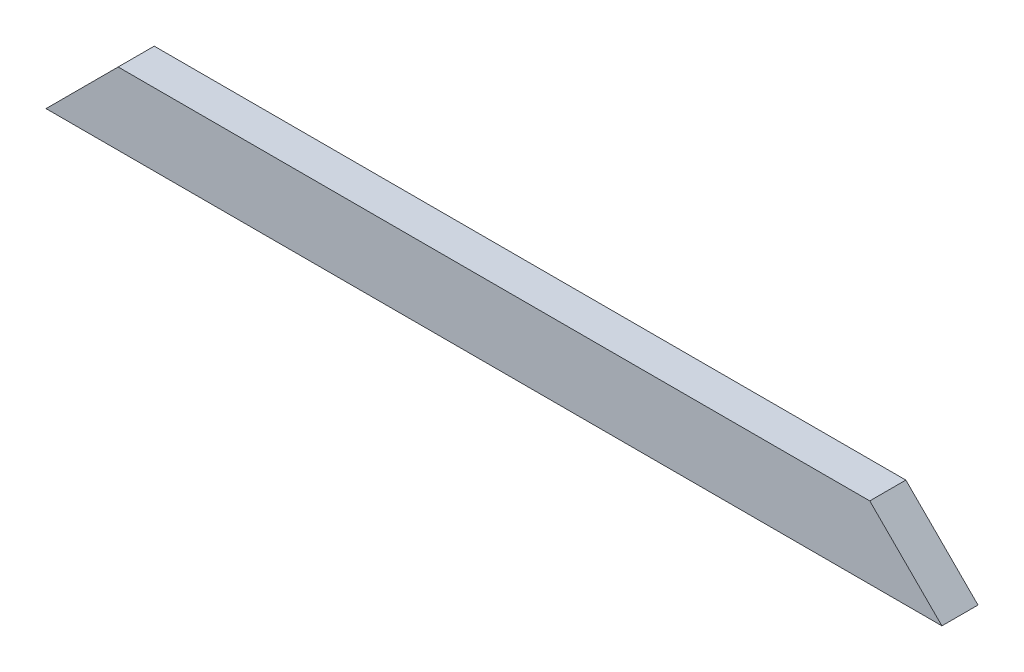
ISO-10303-21;
HEADER;
FILE_DESCRIPTION(('STEP AP214'),'2;1');
FILE_NAME('part.step','',(''),(''),'','','');
FILE_SCHEMA(('AUTOMOTIVE_DESIGN { 1 0 10303 214 1 1 1 1 }'));
ENDSEC;
DATA;
#1=APPLICATION_CONTEXT('core data for automotive mechanical design processes');
#2=APPLICATION_PROTOCOL_DEFINITION('international standard','automotive_design',2000,#1);
#3=PRODUCT_CONTEXT('',#1,'mechanical');
#4=PRODUCT('Part','Part','',(#3));
#5=PRODUCT_RELATED_PRODUCT_CATEGORY('part','',(#4));
#6=PRODUCT_DEFINITION_FORMATION('','',#4);
#7=PRODUCT_DEFINITION_CONTEXT('part definition',#1,'design');
#8=PRODUCT_DEFINITION('design','',#6,#7);
#9=PRODUCT_DEFINITION_SHAPE('','',#8);
#10=(LENGTH_UNIT() NAMED_UNIT(*) SI_UNIT(.MILLI.,.METRE.));
#11=(NAMED_UNIT(*) PLANE_ANGLE_UNIT() SI_UNIT($,.RADIAN.));
#12=(NAMED_UNIT(*) SI_UNIT($,.STERADIAN.) SOLID_ANGLE_UNIT());
#13=UNCERTAINTY_MEASURE_WITH_UNIT(LENGTH_MEASURE(1.E-05),#10,'distance_accuracy_value','');
#14=(GEOMETRIC_REPRESENTATION_CONTEXT(3) GLOBAL_UNCERTAINTY_ASSIGNED_CONTEXT((#13)) GLOBAL_UNIT_ASSIGNED_CONTEXT((#10,
#11,#12)) REPRESENTATION_CONTEXT('',''));
#15=CARTESIAN_POINT('',(0.,0.,0.));
#16=DIRECTION('',(0.,0.,1.));
#17=DIRECTION('',(1.,0.,0.));
#18=AXIS2_PLACEMENT_3D('',#15,#16,#17);
#19=CARTESIAN_POINT('',(0.,0.,19.05));
#20=DIRECTION('',(0.,1.,0.));
#21=DIRECTION('',(0.,0.,1.));
#22=AXIS2_PLACEMENT_3D('',#19,#20,#21);
#23=PLANE('',#22);
#24=DIRECTION('',(1.,0.,0.));
#25=VECTOR('',#24,1.);
#26=CARTESIAN_POINT('',(0.,0.,0.));
#27=LINE('',#26,#25);
#28=CARTESIAN_POINT('',(0.,0.,0.));
#29=VERTEX_POINT('',#28);
#30=CARTESIAN_POINT('',(473.075,0.,0.));
#31=VERTEX_POINT('',#30);
#32=EDGE_CURVE('E96',#29,#31,#27,.T.);
#33=ORIENTED_EDGE('',*,*,#32,.T.);
#34=DIRECTION('',(0.,0.,-1.));
#35=VECTOR('',#34,1.);
#36=CARTESIAN_POINT('',(473.075,0.,19.05));
#37=LINE('',#36,#35);
#38=CARTESIAN_POINT('',(473.075,0.,19.05));
#39=VERTEX_POINT('',#38);
#40=EDGE_CURVE('E11',#39,#31,#37,.T.);
#41=ORIENTED_EDGE('',*,*,#40,.F.);
#42=DIRECTION('',(1.,0.,0.));
#43=VECTOR('',#42,1.);
#44=CARTESIAN_POINT('',(0.,0.,19.05));
#45=LINE('',#44,#43);
#46=CARTESIAN_POINT('',(0.,0.,19.05));
#47=VERTEX_POINT('',#46);
#48=EDGE_CURVE('E84',#47,#39,#45,.T.);
#49=ORIENTED_EDGE('',*,*,#48,.F.);
#50=DIRECTION('',(0.,0.,-1.));
#51=VECTOR('',#50,1.);
#52=CARTESIAN_POINT('',(0.,0.,19.05));
#53=LINE('',#52,#51);
#54=EDGE_CURVE('E92',#47,#29,#53,.T.);
#55=ORIENTED_EDGE('',*,*,#54,.T.);
#56=EDGE_LOOP('',(#33,#41,#49,#55));
#57=FACE_BOUND('',#56,.T.);
#58=ADVANCED_FACE('F33',(#57),#23,.F.);
#59=CARTESIAN_POINT('',(473.075,0.,19.05));
#60=DIRECTION('',(-0.707106781186545,-0.70710678118655,0.));
#61=DIRECTION('',(0.70710678118655,-0.707106781186545,0.));
#62=AXIS2_PLACEMENT_3D('',#59,#60,#61);
#63=PLANE('',#62);
#64=DIRECTION('',(-0.70710678118655,0.707106781186545,0.));
#65=VECTOR('',#64,1.);
#66=CARTESIAN_POINT('',(473.075,0.,0.));
#67=LINE('',#66,#65);
#68=CARTESIAN_POINT('',(434.975,38.1,0.));
#69=VERTEX_POINT('',#68);
#70=EDGE_CURVE('E88',#31,#69,#67,.T.);
#71=ORIENTED_EDGE('',*,*,#70,.T.);
#72=DIRECTION('',(0.,0.,-1.));
#73=VECTOR('',#72,1.);
#74=CARTESIAN_POINT('',(434.975,38.1,19.05));
#75=LINE('',#74,#73);
#76=CARTESIAN_POINT('',(434.975,38.1,19.05));
#77=VERTEX_POINT('',#76);
#78=EDGE_CURVE('E41',#77,#69,#75,.T.);
#79=ORIENTED_EDGE('',*,*,#78,.F.);
#80=DIRECTION('',(-0.70710678118655,0.707106781186545,0.));
#81=VECTOR('',#80,1.);
#82=CARTESIAN_POINT('',(473.075,0.,19.05));
#83=LINE('',#82,#81);
#84=EDGE_CURVE('E79',#39,#77,#83,.T.);
#85=ORIENTED_EDGE('',*,*,#84,.F.);
#86=ORIENTED_EDGE('',*,*,#40,.T.);
#87=EDGE_LOOP('',(#71,#79,#85,#86));
#88=FACE_BOUND('',#87,.T.);
#89=ADVANCED_FACE('F87',(#88),#63,.F.);
#90=CARTESIAN_POINT('',(38.0999999999998,38.1,19.05));
#91=DIRECTION('',(0.,-1.,0.));
#92=DIRECTION('',(0.,0.,-1.));
#93=AXIS2_PLACEMENT_3D('',#90,#91,#92);
#94=PLANE('',#93);
#95=DIRECTION('',(-1.,0.,0.));
#96=VECTOR('',#95,1.);
#97=CARTESIAN_POINT('',(38.0999999999998,38.1,0.));
#98=LINE('',#97,#96);
#99=CARTESIAN_POINT('',(38.0999999999998,38.1,0.));
#100=VERTEX_POINT('',#99);
#101=EDGE_CURVE('E66',#69,#100,#98,.T.);
#102=ORIENTED_EDGE('',*,*,#101,.T.);
#103=DIRECTION('',(0.,0.,-1.));
#104=VECTOR('',#103,1.);
#105=CARTESIAN_POINT('',(38.0999999999998,38.1,19.05));
#106=LINE('',#105,#104);
#107=CARTESIAN_POINT('',(38.0999999999998,38.1,19.05));
#108=VERTEX_POINT('',#107);
#109=EDGE_CURVE('E89',#108,#100,#106,.T.);
#110=ORIENTED_EDGE('',*,*,#109,.F.);
#111=DIRECTION('',(-1.,0.,0.));
#112=VECTOR('',#111,1.);
#113=CARTESIAN_POINT('',(38.0999999999998,38.1,19.05));
#114=LINE('',#113,#112);
#115=EDGE_CURVE('E82',#77,#108,#114,.T.);
#116=ORIENTED_EDGE('',*,*,#115,.F.);
#117=ORIENTED_EDGE('',*,*,#78,.T.);
#118=EDGE_LOOP('',(#102,#110,#116,#117));
#119=FACE_BOUND('',#118,.T.);
#120=ADVANCED_FACE('F90',(#119),#94,.F.);
#121=CARTESIAN_POINT('',(0.,0.,19.05));
#122=DIRECTION('',(0.707106781186549,-0.707106781186546,0.));
#123=DIRECTION('',(0.707106781186546,0.707106781186549,0.));
#124=AXIS2_PLACEMENT_3D('',#121,#122,#123);
#125=PLANE('',#124);
#126=DIRECTION('',(-0.707106781186546,-0.707106781186549,0.));
#127=VECTOR('',#126,1.);
#128=CARTESIAN_POINT('',(0.,0.,0.));
#129=LINE('',#128,#127);
#130=EDGE_CURVE('E72',#100,#29,#129,.T.);
#131=ORIENTED_EDGE('',*,*,#130,.T.);
#132=ORIENTED_EDGE('',*,*,#54,.F.);
#133=DIRECTION('',(-0.707106781186546,-0.707106781186549,0.));
#134=VECTOR('',#133,1.);
#135=CARTESIAN_POINT('',(0.,0.,19.05));
#136=LINE('',#135,#134);
#137=EDGE_CURVE('E49',#108,#47,#136,.T.);
#138=ORIENTED_EDGE('',*,*,#137,.F.);
#139=ORIENTED_EDGE('',*,*,#109,.T.);
#140=EDGE_LOOP('',(#131,#132,#138,#139));
#141=FACE_BOUND('',#140,.T.);
#142=ADVANCED_FACE('F103',(#141),#125,.F.);
#143=CARTESIAN_POINT('',(0.,0.,19.05));
#144=DIRECTION('',(0.,0.,1.));
#145=DIRECTION('',(1.,0.,0.));
#146=AXIS2_PLACEMENT_3D('',#143,#144,#145);
#147=PLANE('',#146);
#148=ORIENTED_EDGE('',*,*,#48,.T.);
#149=ORIENTED_EDGE('',*,*,#84,.T.);
#150=ORIENTED_EDGE('',*,*,#115,.T.);
#151=ORIENTED_EDGE('',*,*,#137,.T.);
#152=EDGE_LOOP('',(#148,#149,#150,#151));
#153=FACE_BOUND('',#152,.T.);
#154=ADVANCED_FACE('F80',(#153),#147,.T.);
#155=CARTESIAN_POINT('',(0.,0.,0.));
#156=DIRECTION('',(0.,0.,1.));
#157=DIRECTION('',(1.,0.,0.));
#158=AXIS2_PLACEMENT_3D('',#155,#156,#157);
#159=PLANE('',#158);
#160=ORIENTED_EDGE('',*,*,#32,.F.);
#161=ORIENTED_EDGE('',*,*,#130,.F.);
#162=ORIENTED_EDGE('',*,*,#101,.F.);
#163=ORIENTED_EDGE('',*,*,#70,.F.);
#164=EDGE_LOOP('',(#160,#161,#162,#163));
#165=FACE_BOUND('',#164,.T.);
#166=ADVANCED_FACE('F106',(#165),#159,.F.);
#167=CLOSED_SHELL('',(#58,#89,#120,#142,#154,#166));
#168=MANIFOLD_SOLID_BREP('B2',#167);
#169=ADVANCED_BREP_SHAPE_REPRESENTATION('',(#18,#168),#14);
#170=SHAPE_DEFINITION_REPRESENTATION(#9,#169);
ENDSEC;
END-ISO-10303-21;
